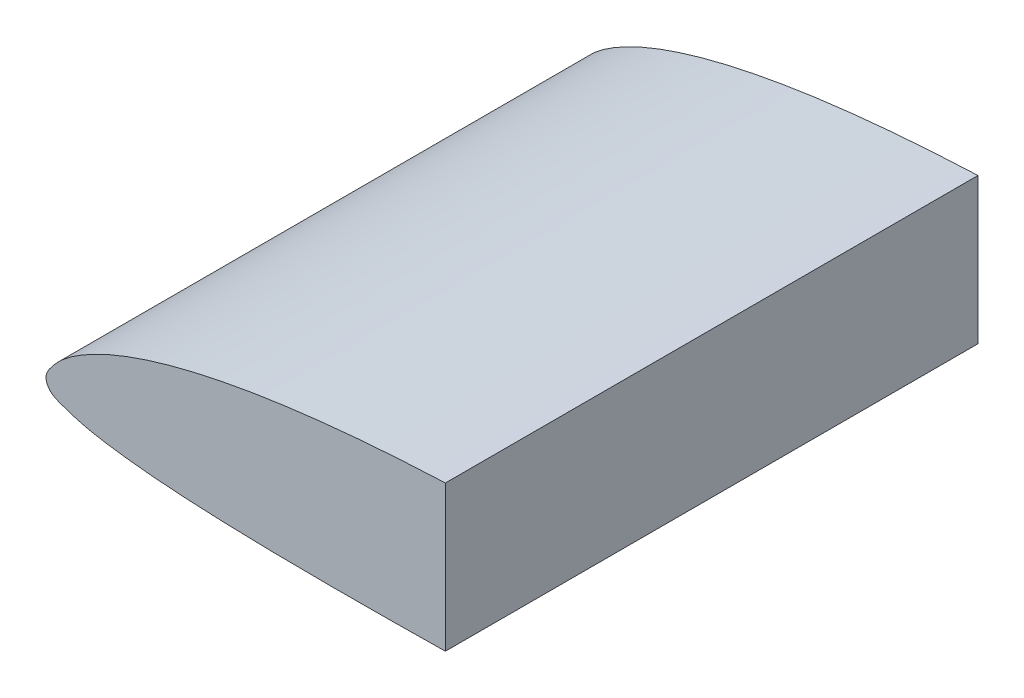
ISO-10303-21;
HEADER;
FILE_DESCRIPTION(('STEP AP214'),'2;1');
FILE_NAME('part.step','',(''),(''),'','','');
FILE_SCHEMA(('AUTOMOTIVE_DESIGN { 1 0 10303 214 1 1 1 1 }'));
ENDSEC;
DATA;
#1=APPLICATION_CONTEXT('core data for automotive mechanical design processes');
#2=APPLICATION_PROTOCOL_DEFINITION('international standard','automotive_design',2000,#1);
#3=PRODUCT_CONTEXT('',#1,'mechanical');
#4=PRODUCT('Part','Part','',(#3));
#5=PRODUCT_RELATED_PRODUCT_CATEGORY('part','',(#4));
#6=PRODUCT_DEFINITION_FORMATION('','',#4);
#7=PRODUCT_DEFINITION_CONTEXT('part definition',#1,'design');
#8=PRODUCT_DEFINITION('design','',#6,#7);
#9=PRODUCT_DEFINITION_SHAPE('','',#8);
#10=(LENGTH_UNIT() NAMED_UNIT(*) SI_UNIT(.MILLI.,.METRE.));
#11=(NAMED_UNIT(*) PLANE_ANGLE_UNIT() SI_UNIT($,.RADIAN.));
#12=(NAMED_UNIT(*) SI_UNIT($,.STERADIAN.) SOLID_ANGLE_UNIT());
#13=UNCERTAINTY_MEASURE_WITH_UNIT(LENGTH_MEASURE(1.E-05),#10,'distance_accuracy_value','');
#14=(GEOMETRIC_REPRESENTATION_CONTEXT(3) GLOBAL_UNCERTAINTY_ASSIGNED_CONTEXT((#13)) GLOBAL_UNIT_ASSIGNED_CONTEXT((#10,
#11,#12)) REPRESENTATION_CONTEXT('',''));
#15=CARTESIAN_POINT('',(0.,0.,0.));
#16=DIRECTION('',(0.,0.,1.));
#17=DIRECTION('',(1.,0.,0.));
#18=AXIS2_PLACEMENT_3D('',#15,#16,#17);
#19=CARTESIAN_POINT('',(304.8,0.,101.6));
#20=CARTESIAN_POINT('',(304.801618834867,0.0105404782342497,101.6));
#21=CARTESIAN_POINT('',(302.668974732205,0.220720306657686,101.6));
#22=CARTESIAN_POINT('',(300.521978172348,0.544561192924455,101.6));
#23=CARTESIAN_POINT('',(295.368886494755,1.2875328814366,101.6));
#24=CARTESIAN_POINT('',(289.160913878016,2.33645198943612,101.6));
#25=CARTESIAN_POINT('',(281.213840868588,3.71952821524651,101.6));
#26=CARTESIAN_POINT('',(272.021147758702,5.34248875191025,101.6));
#27=CARTESIAN_POINT('',(261.61106980903,7.12581444026362,101.6));
#28=CARTESIAN_POINT('',(250.148168886435,8.97226886192319,101.6));
#29=CARTESIAN_POINT('',(237.729227104966,10.7955186206566,101.6));
#30=CARTESIAN_POINT('',(224.4666688294,12.5459449601576,101.6));
#31=CARTESIAN_POINT('',(210.486966245019,14.2121187859213,101.6));
#32=CARTESIAN_POINT('',(195.939334379785,15.7786391055407,101.6));
#33=CARTESIAN_POINT('',(180.985449003124,17.2134697935107,101.6));
#34=CARTESIAN_POINT('',(165.790506747141,18.4813404806245,101.6));
#35=CARTESIAN_POINT('',(150.517335733816,19.5549981658971,101.6));
#36=CARTESIAN_POINT('',(135.325856865066,20.3976314342068,101.6));
#37=CARTESIAN_POINT('',(120.373654992444,20.983402039553,101.6));
#38=CARTESIAN_POINT('',(105.811891909707,21.2901601969632,101.6));
#39=CARTESIAN_POINT('',(91.7834874256825,21.2891036129287,101.6));
#40=CARTESIAN_POINT('',(78.4213620958899,20.9724951941915,101.6));
#41=CARTESIAN_POINT('',(65.8465275942558,20.3288254222291,101.6));
#42=CARTESIAN_POINT('',(54.1674017080585,19.3418794529403,101.6));
#43=CARTESIAN_POINT('',(43.474395079397,18.0330161813823,101.6));
#44=CARTESIAN_POINT('',(33.848689518524,16.4081639477774,101.6));
#45=CARTESIAN_POINT('',(25.3525506097424,14.4995409589336,101.6));
#46=CARTESIAN_POINT('',(18.0396313851052,12.3489155419126,101.6));
#47=CARTESIAN_POINT('',(11.9313896383541,10.0040370443031,101.6));
#48=CARTESIAN_POINT('',(7.08806507391777,7.53974305233434,101.6));
#49=CARTESIAN_POINT('',(3.40966941680189,5.06299945206396,101.6));
#50=CARTESIAN_POINT('',(1.15047901155272,2.68947505766282,101.6));
#51=CARTESIAN_POINT('',(-0.341456030932099,0.406213919537651,101.6));
#52=CARTESIAN_POINT('',(0.675206570607262,-2.00354445611635,101.6));
#53=CARTESIAN_POINT('',(3.58588645216127,-3.09345358903431,101.6));
#54=CARTESIAN_POINT('',(7.58846446919399,-4.35432891948392,101.6));
#55=CARTESIAN_POINT('',(13.2868004017993,-5.2878446315287,101.6));
#56=CARTESIAN_POINT('',(20.4322213072078,-6.08390726300857,101.6));
#57=CARTESIAN_POINT('',(29.0601683745068,-6.63974445543199,101.6));
#58=CARTESIAN_POINT('',(39.0679392576195,-6.99535450967022,101.6));
#59=CARTESIAN_POINT('',(50.3738441198648,-7.15527669006167,101.6));
#60=CARTESIAN_POINT('',(62.8572545491746,-7.14769616357257,101.6));
#61=CARTESIAN_POINT('',(76.3838964062546,-6.99316288317003,101.6));
#62=CARTESIAN_POINT('',(90.803190635399,-6.69861797165631,101.6));
#63=CARTESIAN_POINT('',(105.956834514056,-6.28368257572137,101.6));
#64=CARTESIAN_POINT('',(121.677348300616,-5.77052452309991,101.6));
#65=CARTESIAN_POINT('',(137.789976771838,-5.17586180163704,101.6));
#66=CARTESIAN_POINT('',(154.114864341391,-4.5177658027107,101.6));
#67=CARTESIAN_POINT('',(170.470018260583,-3.81546046006647,101.6));
#68=CARTESIAN_POINT('',(186.670857634618,-3.10033802920193,101.6));
#69=CARTESIAN_POINT('',(202.53208503216,-2.39092903583911,101.6));
#70=CARTESIAN_POINT('',(217.868391943782,-1.72482697070617,101.6));
#71=CARTESIAN_POINT('',(232.49282342498,-1.11499096294753,101.6));
#72=CARTESIAN_POINT('',(246.220887098932,-0.613930048939535,101.6));
#73=CARTESIAN_POINT('',(258.861467046827,-0.21565642278579,101.6));
#74=CARTESIAN_POINT('',(270.253080456814,0.0553538764319012,101.6));
#75=CARTESIAN_POINT('',(280.188997103178,0.219595784232055,101.6));
#76=CARTESIAN_POINT('',(288.650498905082,0.274785104169071,101.6));
#77=CARTESIAN_POINT('',(295.155593423962,0.261686700063953,101.6));
#78=CARTESIAN_POINT('',(300.464576396964,0.143666173546565,101.6));
#79=CARTESIAN_POINT('',(302.659622580391,0.115723261363336,101.6));
#80=CARTESIAN_POINT('',(304.798389635185,-0.010485328450841,101.6));
#81=CARTESIAN_POINT('',(304.8,0.,101.6));
#82=B_SPLINE_CURVE_WITH_KNOTS('',3,(#19,#20,#21,#22,#23,#24,#25,#26,#27,#28,#29,#30,#31,#32,#33,
#34,#35,#36,#37,#38,#39,#40,#41,#42,#43,#44,#45,#46,#47,#48,#49,#50,#51,#52,#53,#54,#55,#56,#57,
#58,#59,#60,#61,#62,#63,#64,#65,#66,#67,#68,#69,#70,#71,#72,#73,#74,#75,#76,#77,#78,#79,#80,
#81),.UNSPECIFIED.,.T.,.F.,(4,1,1,1,1,1,1,1,1,1,1,1,1,1,1,1,1,1,1,1,1,1,1,1,1,1,1,1,1,1,1,1,1,1,
1,1,1,1,1,1,1,1,1,1,1,1,1,1,1,1,1,1,1,1,1,1,1,1,1,1,4),(0.,0.00163269975936438,
0.00645583458730916,0.0142733719650962,0.0248437929891213,0.0378823655436665,0.0531077412083435,
0.0702622662658386,0.0891122502270111,0.109473671361897,0.13118279114636,0.154044071471589,
0.177807645474636,0.202201781747178,0.22695975540666,0.25181615217405,0.276516239060432,
0.300807474077759,0.324444283219669,0.347208207468047,0.368893732879896,0.38931364936161,
0.408315169114752,0.425773142382184,0.441588353173764,0.455679939739565,0.468012176237163,
0.47856661795016,0.487362799824908,0.494418821257916,0.499795181040829,0.503597783370769,
0.506520218572362,0.511061336465782,0.517923774571212,0.527204743484056,0.538873845676215,
0.552882495022793,0.569133331358659,0.587485764973588,0.607759264884705,0.629725606442591,
0.653145173637746,0.67776248750032,0.703306431792791,0.729490768205414,0.756024037319581,
0.782609438114174,0.80894956263962,0.834737242055006,0.859674704050141,0.883459774321026,
0.905784827252887,0.92634926584387,0.944857552516611,0.961054710792989,0.97470052921618,
0.985589471560421,0.993530514736504,0.998375842835772,1.),.UNSPECIFIED.);
#83=DIRECTION('',(0.,0.,-1.));
#84=VECTOR('',#83,1.);
#85=SURFACE_OF_LINEAR_EXTRUSION('',#82,#84);
#86=CARTESIAN_POINT('',(76.2,20.8247578525033,101.6));
#87=VERTEX_POINT('',#86);
#88=CARTESIAN_POINT('',(76.1999999999978,-6.97503984705095,101.6));
#89=VERTEX_POINT('',#88);
#90=EDGE_CURVE('E11',#87,#89,#82,.T.);
#91=ORIENTED_EDGE('',*,*,#90,.F.);
#92=DIRECTION('',(0.,0.,1.));
#93=VECTOR('',#92,1.);
#94=CARTESIAN_POINT('',(76.2,20.8247578525033,-294.765072388154));
#95=LINE('',#94,#93);
#96=CARTESIAN_POINT('',(76.2,20.8247578525033,0.));
#97=VERTEX_POINT('',#96);
#98=EDGE_CURVE('E72',#97,#87,#95,.T.);
#99=ORIENTED_EDGE('',*,*,#98,.F.);
#100=CARTESIAN_POINT('',(304.8,0.,0.));
#101=CARTESIAN_POINT('',(304.801618834867,0.0105404782342497,0.));
#102=CARTESIAN_POINT('',(302.668974732205,0.220720306657686,0.));
#103=CARTESIAN_POINT('',(300.521978172348,0.544561192924455,0.));
#104=CARTESIAN_POINT('',(295.368886494755,1.2875328814366,0.));
#105=CARTESIAN_POINT('',(289.160913878016,2.33645198943612,0.));
#106=CARTESIAN_POINT('',(281.213840868588,3.71952821524651,0.));
#107=CARTESIAN_POINT('',(272.021147758702,5.34248875191025,0.));
#108=CARTESIAN_POINT('',(261.61106980903,7.12581444026362,0.));
#109=CARTESIAN_POINT('',(250.148168886435,8.97226886192319,0.));
#110=CARTESIAN_POINT('',(237.729227104966,10.7955186206566,0.));
#111=CARTESIAN_POINT('',(224.4666688294,12.5459449601576,0.));
#112=CARTESIAN_POINT('',(210.486966245019,14.2121187859213,0.));
#113=CARTESIAN_POINT('',(195.939334379785,15.7786391055407,0.));
#114=CARTESIAN_POINT('',(180.985449003124,17.2134697935107,0.));
#115=CARTESIAN_POINT('',(165.790506747141,18.4813404806245,0.));
#116=CARTESIAN_POINT('',(150.517335733816,19.5549981658971,0.));
#117=CARTESIAN_POINT('',(135.325856865066,20.3976314342068,0.));
#118=CARTESIAN_POINT('',(120.373654992444,20.983402039553,0.));
#119=CARTESIAN_POINT('',(105.811891909707,21.2901601969632,0.));
#120=CARTESIAN_POINT('',(91.7834874256825,21.2891036129287,0.));
#121=CARTESIAN_POINT('',(78.4213620958899,20.9724951941915,0.));
#122=CARTESIAN_POINT('',(65.8465275942558,20.3288254222291,0.));
#123=CARTESIAN_POINT('',(54.1674017080585,19.3418794529403,0.));
#124=CARTESIAN_POINT('',(43.474395079397,18.0330161813823,0.));
#125=CARTESIAN_POINT('',(33.848689518524,16.4081639477774,0.));
#126=CARTESIAN_POINT('',(25.3525506097424,14.4995409589336,0.));
#127=CARTESIAN_POINT('',(18.0396313851052,12.3489155419126,0.));
#128=CARTESIAN_POINT('',(11.9313896383541,10.0040370443031,0.));
#129=CARTESIAN_POINT('',(7.08806507391777,7.53974305233434,0.));
#130=CARTESIAN_POINT('',(3.40966941680189,5.06299945206396,0.));
#131=CARTESIAN_POINT('',(1.15047901155272,2.68947505766282,0.));
#132=CARTESIAN_POINT('',(-0.341456030932099,0.406213919537651,0.));
#133=CARTESIAN_POINT('',(0.675206570607262,-2.00354445611635,0.));
#134=CARTESIAN_POINT('',(3.58588645216127,-3.09345358903431,0.));
#135=CARTESIAN_POINT('',(7.58846446919399,-4.35432891948392,0.));
#136=CARTESIAN_POINT('',(13.2868004017993,-5.2878446315287,0.));
#137=CARTESIAN_POINT('',(20.4322213072078,-6.08390726300857,0.));
#138=CARTESIAN_POINT('',(29.0601683745068,-6.63974445543199,0.));
#139=CARTESIAN_POINT('',(39.0679392576195,-6.99535450967022,0.));
#140=CARTESIAN_POINT('',(50.3738441198648,-7.15527669006167,0.));
#141=CARTESIAN_POINT('',(62.8572545491746,-7.14769616357257,0.));
#142=CARTESIAN_POINT('',(76.3838964062546,-6.99316288317003,0.));
#143=CARTESIAN_POINT('',(90.803190635399,-6.69861797165631,0.));
#144=CARTESIAN_POINT('',(105.956834514056,-6.28368257572137,0.));
#145=CARTESIAN_POINT('',(121.677348300616,-5.77052452309991,0.));
#146=CARTESIAN_POINT('',(137.789976771838,-5.17586180163704,0.));
#147=CARTESIAN_POINT('',(154.114864341391,-4.5177658027107,0.));
#148=CARTESIAN_POINT('',(170.470018260583,-3.81546046006647,0.));
#149=CARTESIAN_POINT('',(186.670857634618,-3.10033802920193,0.));
#150=CARTESIAN_POINT('',(202.53208503216,-2.39092903583911,0.));
#151=CARTESIAN_POINT('',(217.868391943782,-1.72482697070617,0.));
#152=CARTESIAN_POINT('',(232.49282342498,-1.11499096294753,0.));
#153=CARTESIAN_POINT('',(246.220887098932,-0.613930048939535,0.));
#154=CARTESIAN_POINT('',(258.861467046827,-0.21565642278579,0.));
#155=CARTESIAN_POINT('',(270.253080456814,0.0553538764319012,0.));
#156=CARTESIAN_POINT('',(280.188997103178,0.219595784232055,0.));
#157=CARTESIAN_POINT('',(288.650498905082,0.274785104169071,0.));
#158=CARTESIAN_POINT('',(295.155593423962,0.261686700063953,0.));
#159=CARTESIAN_POINT('',(300.464576396964,0.143666173546565,0.));
#160=CARTESIAN_POINT('',(302.659622580391,0.115723261363336,0.));
#161=CARTESIAN_POINT('',(304.798389635185,-0.010485328450841,0.));
#162=CARTESIAN_POINT('',(304.8,0.,0.));
#163=B_SPLINE_CURVE_WITH_KNOTS('',3,(#100,#101,#102,#103,#104,#105,#106,#107,#108,#109,#110,
#111,#112,#113,#114,#115,#116,#117,#118,#119,#120,#121,#122,#123,#124,#125,#126,#127,#128,#129,
#130,#131,#132,#133,#134,#135,#136,#137,#138,#139,#140,#141,#142,#143,#144,#145,#146,#147,#148,
#149,#150,#151,#152,#153,#154,#155,#156,#157,#158,#159,#160,#161,#162),.UNSPECIFIED.,.T.,.F.,(4,
1,1,1,1,1,1,1,1,1,1,1,1,1,1,1,1,1,1,1,1,1,1,1,1,1,1,1,1,1,1,1,1,1,1,1,1,1,1,1,1,1,1,1,1,1,1,1,1,
1,1,1,1,1,1,1,1,1,1,1,4),(0.,0.00163269975936438,0.00645583458730916,0.0142733719650962,
0.0248437929891213,0.0378823655436665,0.0531077412083435,0.0702622662658386,0.0891122502270111,
0.109473671361897,0.13118279114636,0.154044071471589,0.177807645474636,0.202201781747178,
0.22695975540666,0.25181615217405,0.276516239060432,0.300807474077759,0.324444283219669,
0.347208207468047,0.368893732879896,0.38931364936161,0.408315169114752,0.425773142382184,
0.441588353173764,0.455679939739565,0.468012176237163,0.47856661795016,0.487362799824908,
0.494418821257916,0.499795181040829,0.503597783370769,0.506520218572362,0.511061336465782,
0.517923774571212,0.527204743484056,0.538873845676215,0.552882495022793,0.569133331358659,
0.587485764973588,0.607759264884705,0.629725606442591,0.653145173637746,0.67776248750032,
0.703306431792791,0.729490768205414,0.756024037319581,0.782609438114174,0.80894956263962,
0.834737242055006,0.859674704050141,0.883459774321026,0.905784827252887,0.92634926584387,
0.944857552516611,0.961054710792989,0.97470052921618,0.985589471560421,0.993530514736504,
0.998375842835772,1.),.UNSPECIFIED.);
#164=CARTESIAN_POINT('',(76.1999999999978,-6.97503984705095,0.));
#165=VERTEX_POINT('',#164);
#166=EDGE_CURVE('E53',#97,#165,#163,.T.);
#167=ORIENTED_EDGE('',*,*,#166,.T.);
#168=DIRECTION('',(0.,0.,1.));
#169=VECTOR('',#168,1.);
#170=CARTESIAN_POINT('',(76.1999999999978,-6.97503984705095,-294.765072388154));
#171=LINE('',#170,#169);
#172=EDGE_CURVE('E66',#165,#89,#171,.T.);
#173=ORIENTED_EDGE('',*,*,#172,.T.);
#174=EDGE_LOOP('',(#91,#99,#167,#173));
#175=FACE_BOUND('',#174,.T.);
#176=ADVANCED_FACE('F49',(#175),#85,.F.);
#177=CARTESIAN_POINT('',(0.901947745585612,2.21992263356822,101.6));
#178=DIRECTION('',(0.,0.,-1.));
#179=DIRECTION('',(-1.,0.,0.));
#180=AXIS2_PLACEMENT_3D('',#177,#178,#179);
#181=PLANE('',#180);
#182=ORIENTED_EDGE('',*,*,#90,.T.);
#183=DIRECTION('',(0.,-1.,0.));
#184=VECTOR('',#183,1.);
#185=CARTESIAN_POINT('',(76.2,0.,101.6));
#186=LINE('',#185,#184);
#187=EDGE_CURVE('E82',#87,#89,#186,.T.);
#188=ORIENTED_EDGE('',*,*,#187,.F.);
#189=EDGE_LOOP('',(#182,#188));
#190=FACE_BOUND('',#189,.T.);
#191=ADVANCED_FACE('F107',(#190),#181,.F.);
#192=CARTESIAN_POINT('',(0.901947745585612,2.21992263356822,0.));
#193=DIRECTION('',(0.,0.,-1.));
#194=DIRECTION('',(-1.,0.,0.));
#195=AXIS2_PLACEMENT_3D('',#192,#193,#194);
#196=PLANE('',#195);
#197=DIRECTION('',(0.,-1.,0.));
#198=VECTOR('',#197,1.);
#199=CARTESIAN_POINT('',(76.2,0.,0.));
#200=LINE('',#199,#198);
#201=EDGE_CURVE('E76',#97,#165,#200,.T.);
#202=ORIENTED_EDGE('',*,*,#201,.T.);
#203=ORIENTED_EDGE('',*,*,#166,.F.);
#204=EDGE_LOOP('',(#202,#203));
#205=FACE_BOUND('',#204,.T.);
#206=ADVANCED_FACE('F88',(#205),#196,.T.);
#207=CARTESIAN_POINT('',(76.2,0.,-294.765072388154));
#208=DIRECTION('',(-1.,0.,0.));
#209=DIRECTION('',(0.,-1.,0.));
#210=AXIS2_PLACEMENT_3D('',#207,#208,#209);
#211=PLANE('',#210);
#212=ORIENTED_EDGE('',*,*,#98,.T.);
#213=ORIENTED_EDGE('',*,*,#187,.T.);
#214=ORIENTED_EDGE('',*,*,#172,.F.);
#215=ORIENTED_EDGE('',*,*,#201,.F.);
#216=EDGE_LOOP('',(#212,#213,#214,#215));
#217=FACE_BOUND('',#216,.T.);
#218=ADVANCED_FACE('F77',(#217),#211,.F.);
#219=CLOSED_SHELL('',(#176,#191,#206,#218));
#220=MANIFOLD_SOLID_BREP('B2',#219);
#221=ADVANCED_BREP_SHAPE_REPRESENTATION('',(#18,#220),#14);
#222=SHAPE_DEFINITION_REPRESENTATION(#9,#221);
ENDSEC;
END-ISO-10303-21;
